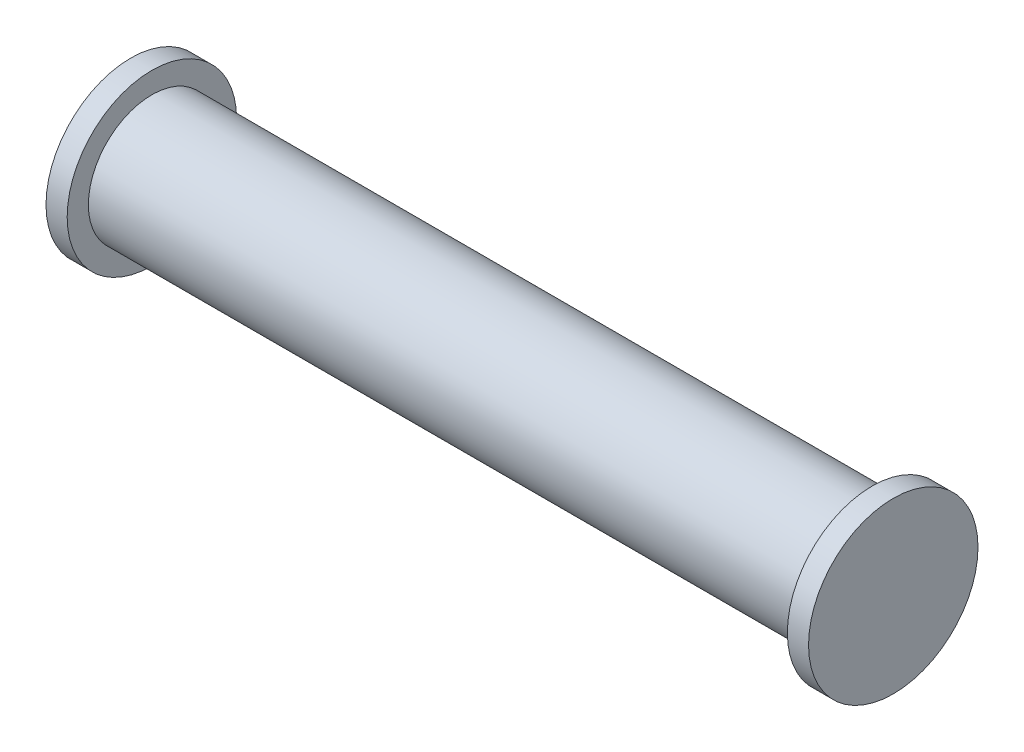
ISO-10303-21;
HEADER;
FILE_DESCRIPTION(('STEP AP214'),'2;1');
FILE_NAME('part.step','',(''),(''),'','','');
FILE_SCHEMA(('AUTOMOTIVE_DESIGN { 1 0 10303 214 1 1 1 1 }'));
ENDSEC;
DATA;
#1=APPLICATION_CONTEXT('core data for automotive mechanical design processes');
#2=APPLICATION_PROTOCOL_DEFINITION('international standard','automotive_design',2000,#1);
#3=PRODUCT_CONTEXT('',#1,'mechanical');
#4=PRODUCT('Part','Part','',(#3));
#5=PRODUCT_RELATED_PRODUCT_CATEGORY('part','',(#4));
#6=PRODUCT_DEFINITION_FORMATION('','',#4);
#7=PRODUCT_DEFINITION_CONTEXT('part definition',#1,'design');
#8=PRODUCT_DEFINITION('design','',#6,#7);
#9=PRODUCT_DEFINITION_SHAPE('','',#8);
#10=(LENGTH_UNIT() NAMED_UNIT(*) SI_UNIT(.MILLI.,.METRE.));
#11=(NAMED_UNIT(*) PLANE_ANGLE_UNIT() SI_UNIT($,.RADIAN.));
#12=(NAMED_UNIT(*) SI_UNIT($,.STERADIAN.) SOLID_ANGLE_UNIT());
#13=UNCERTAINTY_MEASURE_WITH_UNIT(LENGTH_MEASURE(1.E-05),#10,'distance_accuracy_value','');
#14=(GEOMETRIC_REPRESENTATION_CONTEXT(3) GLOBAL_UNCERTAINTY_ASSIGNED_CONTEXT((#13)) GLOBAL_UNIT_ASSIGNED_CONTEXT((#10,
#11,#12)) REPRESENTATION_CONTEXT('',''));
#15=CARTESIAN_POINT('',(0.,0.,0.));
#16=DIRECTION('',(0.,0.,1.));
#17=DIRECTION('',(1.,0.,0.));
#18=AXIS2_PLACEMENT_3D('',#15,#16,#17);
#19=CARTESIAN_POINT('',(43.18,0.,0.));
#20=DIRECTION('',(-1.,0.,0.));
#21=DIRECTION('',(0.,0.,1.));
#22=AXIS2_PLACEMENT_3D('',#19,#20,#21);
#23=CYLINDRICAL_SURFACE('',#22,3.81);
#24=CARTESIAN_POINT('',(43.18,0.,0.));
#25=DIRECTION('',(1.,0.,0.));
#26=DIRECTION('',(0.,0.,-1.));
#27=AXIS2_PLACEMENT_3D('',#24,#25,#26);
#28=CIRCLE('',#27,3.81);
#29=CARTESIAN_POINT('',(43.18,0.,-3.81000000000001));
#30=VERTEX_POINT('',#29);
#31=EDGE_CURVE('E12',#30,#30,#28,.T.);
#32=ORIENTED_EDGE('',*,*,#31,.F.);
#33=EDGE_LOOP('',(#32));
#34=FACE_BOUND('',#33,.T.);
#35=CARTESIAN_POINT('',(0.,0.,0.));
#36=DIRECTION('',(-1.,0.,0.));
#37=DIRECTION('',(0.,0.,1.));
#38=AXIS2_PLACEMENT_3D('',#35,#36,#37);
#39=CIRCLE('',#38,3.81);
#40=CARTESIAN_POINT('',(0.,0.,3.81000000000001));
#41=VERTEX_POINT('',#40);
#42=EDGE_CURVE('E59',#41,#41,#39,.T.);
#43=ORIENTED_EDGE('',*,*,#42,.F.);
#44=EDGE_LOOP('',(#43));
#45=FACE_BOUND('',#44,.T.);
#46=ADVANCED_FACE('F44',(#34,#45),#23,.T.);
#47=CARTESIAN_POINT('',(44.45,0.,0.));
#48=DIRECTION('',(-1.,0.,0.));
#49=DIRECTION('',(0.,0.,1.));
#50=AXIS2_PLACEMENT_3D('',#47,#48,#49);
#51=CYLINDRICAL_SURFACE('',#50,5.08);
#52=CARTESIAN_POINT('',(44.45,0.,0.));
#53=DIRECTION('',(1.,0.,0.));
#54=DIRECTION('',(0.,0.,-1.));
#55=AXIS2_PLACEMENT_3D('',#52,#53,#54);
#56=CIRCLE('',#55,5.08);
#57=CARTESIAN_POINT('',(44.45,0.,-5.08000000000001));
#58=VERTEX_POINT('',#57);
#59=EDGE_CURVE('E50',#58,#58,#56,.T.);
#60=ORIENTED_EDGE('',*,*,#59,.F.);
#61=EDGE_LOOP('',(#60));
#62=FACE_BOUND('',#61,.T.);
#63=CARTESIAN_POINT('',(43.18,0.,0.));
#64=DIRECTION('',(1.,0.,0.));
#65=DIRECTION('',(0.,0.,-1.));
#66=AXIS2_PLACEMENT_3D('',#63,#64,#65);
#67=CIRCLE('',#66,5.08);
#68=CARTESIAN_POINT('',(43.18,0.,-5.08000000000001));
#69=VERTEX_POINT('',#68);
#70=EDGE_CURVE('E54',#69,#69,#67,.T.);
#71=ORIENTED_EDGE('',*,*,#70,.T.);
#72=EDGE_LOOP('',(#71));
#73=FACE_BOUND('',#72,.T.);
#74=ADVANCED_FACE('F88',(#62,#73),#51,.T.);
#75=CARTESIAN_POINT('',(44.45,0.,0.));
#76=DIRECTION('',(1.,0.,0.));
#77=DIRECTION('',(0.,0.,-1.));
#78=AXIS2_PLACEMENT_3D('',#75,#76,#77);
#79=PLANE('',#78);
#80=ORIENTED_EDGE('',*,*,#59,.T.);
#81=EDGE_LOOP('',(#80));
#82=FACE_BOUND('',#81,.T.);
#83=ADVANCED_FACE('F93',(#82),#79,.T.);
#84=CARTESIAN_POINT('',(43.18,0.,0.));
#85=DIRECTION('',(1.,0.,0.));
#86=DIRECTION('',(0.,0.,-1.));
#87=AXIS2_PLACEMENT_3D('',#84,#85,#86);
#88=PLANE('',#87);
#89=ORIENTED_EDGE('',*,*,#31,.T.);
#90=EDGE_LOOP('',(#89));
#91=FACE_BOUND('',#90,.T.);
#92=ORIENTED_EDGE('',*,*,#70,.F.);
#93=EDGE_LOOP('',(#92));
#94=FACE_BOUND('',#93,.T.);
#95=ADVANCED_FACE('F75',(#91,#94),#88,.F.);
#96=CARTESIAN_POINT('',(-1.27,0.,0.));
#97=DIRECTION('',(1.,0.,0.));
#98=DIRECTION('',(0.,0.,-1.));
#99=AXIS2_PLACEMENT_3D('',#96,#97,#98);
#100=CYLINDRICAL_SURFACE('',#99,5.08);
#101=CARTESIAN_POINT('',(-1.27,0.,0.));
#102=DIRECTION('',(-1.,0.,0.));
#103=DIRECTION('',(0.,0.,1.));
#104=AXIS2_PLACEMENT_3D('',#101,#102,#103);
#105=CIRCLE('',#104,5.08);
#106=CARTESIAN_POINT('',(-1.27,0.,5.08000000000001));
#107=VERTEX_POINT('',#106);
#108=EDGE_CURVE('E63',#107,#107,#105,.T.);
#109=ORIENTED_EDGE('',*,*,#108,.F.);
#110=EDGE_LOOP('',(#109));
#111=FACE_BOUND('',#110,.T.);
#112=CARTESIAN_POINT('',(0.,0.,0.));
#113=DIRECTION('',(-1.,0.,0.));
#114=DIRECTION('',(0.,0.,1.));
#115=AXIS2_PLACEMENT_3D('',#112,#113,#114);
#116=CIRCLE('',#115,5.08);
#117=CARTESIAN_POINT('',(0.,0.,5.08000000000001));
#118=VERTEX_POINT('',#117);
#119=EDGE_CURVE('E64',#118,#118,#116,.T.);
#120=ORIENTED_EDGE('',*,*,#119,.T.);
#121=EDGE_LOOP('',(#120));
#122=FACE_BOUND('',#121,.T.);
#123=ADVANCED_FACE('F72',(#111,#122),#100,.T.);
#124=CARTESIAN_POINT('',(-1.27,0.,0.));
#125=DIRECTION('',(-1.,0.,0.));
#126=DIRECTION('',(0.,0.,1.));
#127=AXIS2_PLACEMENT_3D('',#124,#125,#126);
#128=PLANE('',#127);
#129=ORIENTED_EDGE('',*,*,#108,.T.);
#130=EDGE_LOOP('',(#129));
#131=FACE_BOUND('',#130,.T.);
#132=ADVANCED_FACE('F70',(#131),#128,.T.);
#133=CARTESIAN_POINT('',(0.,0.,0.));
#134=DIRECTION('',(-1.,0.,0.));
#135=DIRECTION('',(0.,0.,1.));
#136=AXIS2_PLACEMENT_3D('',#133,#134,#135);
#137=PLANE('',#136);
#138=ORIENTED_EDGE('',*,*,#42,.T.);
#139=EDGE_LOOP('',(#138));
#140=FACE_BOUND('',#139,.T.);
#141=ORIENTED_EDGE('',*,*,#119,.F.);
#142=EDGE_LOOP('',(#141));
#143=FACE_BOUND('',#142,.T.);
#144=ADVANCED_FACE('F79',(#140,#143),#137,.F.);
#145=CLOSED_SHELL('',(#46,#74,#83,#95,#123,#132,#144));
#146=MANIFOLD_SOLID_BREP('B2',#145);
#147=ADVANCED_BREP_SHAPE_REPRESENTATION('',(#18,#146),#14);
#148=SHAPE_DEFINITION_REPRESENTATION(#9,#147);
ENDSEC;
END-ISO-10303-21;
